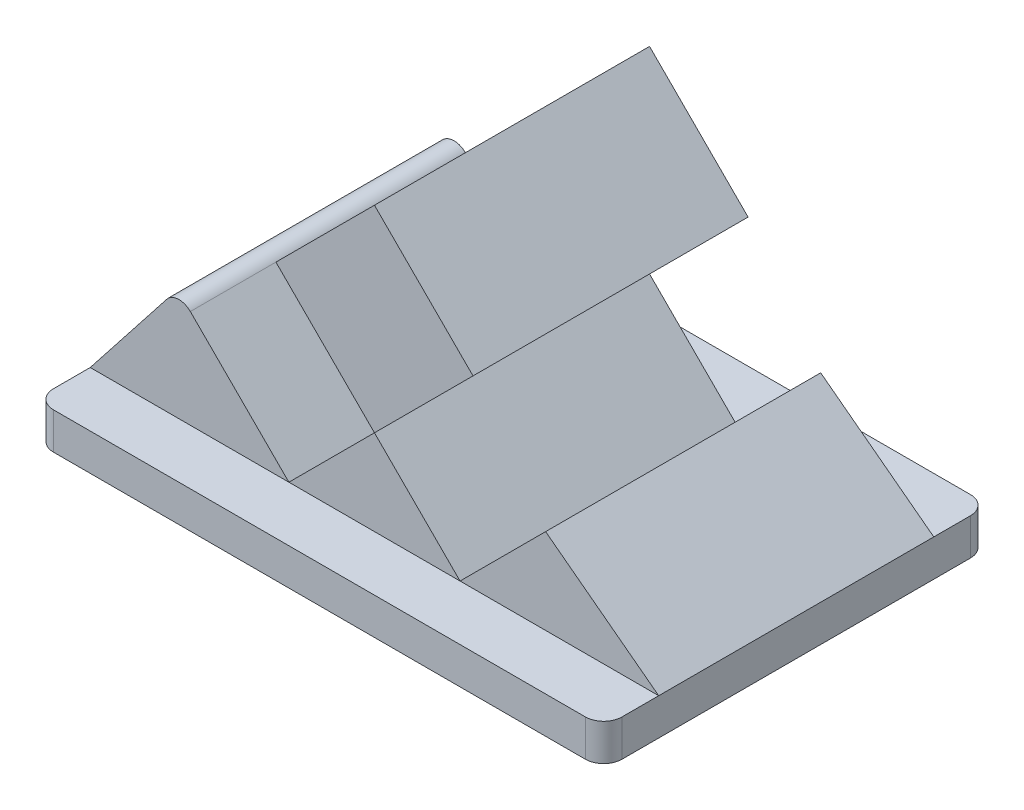
ISO-10303-21;
HEADER;
FILE_DESCRIPTION(('STEP AP214'),'2;1');
FILE_NAME('part.step','',(''),(''),'','','');
FILE_SCHEMA(('AUTOMOTIVE_DESIGN { 1 0 10303 214 1 1 1 1 }'));
ENDSEC;
DATA;
#1=APPLICATION_CONTEXT('core data for automotive mechanical design processes');
#2=APPLICATION_PROTOCOL_DEFINITION('international standard','automotive_design',2000,#1);
#3=PRODUCT_CONTEXT('',#1,'mechanical');
#4=PRODUCT('Part','Part','',(#3));
#5=PRODUCT_RELATED_PRODUCT_CATEGORY('part','',(#4));
#6=PRODUCT_DEFINITION_FORMATION('','',#4);
#7=PRODUCT_DEFINITION_CONTEXT('part definition',#1,'design');
#8=PRODUCT_DEFINITION('design','',#6,#7);
#9=PRODUCT_DEFINITION_SHAPE('','',#8);
#10=(LENGTH_UNIT() NAMED_UNIT(*) SI_UNIT(.MILLI.,.METRE.));
#11=(NAMED_UNIT(*) PLANE_ANGLE_UNIT() SI_UNIT($,.RADIAN.));
#12=(NAMED_UNIT(*) SI_UNIT($,.STERADIAN.) SOLID_ANGLE_UNIT());
#13=UNCERTAINTY_MEASURE_WITH_UNIT(LENGTH_MEASURE(1.E-05),#10,'distance_accuracy_value','');
#14=(GEOMETRIC_REPRESENTATION_CONTEXT(3) GLOBAL_UNCERTAINTY_ASSIGNED_CONTEXT((#13)) GLOBAL_UNIT_ASSIGNED_CONTEXT((#10,
#11,#12)) REPRESENTATION_CONTEXT('',''));
#15=CARTESIAN_POINT('',(0.,0.,0.));
#16=DIRECTION('',(0.,0.,1.));
#17=DIRECTION('',(1.,0.,0.));
#18=AXIS2_PLACEMENT_3D('',#15,#16,#17);
#19=CARTESIAN_POINT('',(87.0746391493337,87.0746391493336,75.));
#20=DIRECTION('',(0.707106781186548,0.707106781186547,0.));
#21=DIRECTION('',(-0.707106781186547,0.707106781186548,0.));
#22=AXIS2_PLACEMENT_3D('',#19,#20,#21);
#23=PLANE('',#22);
#24=DIRECTION('',(0.707106781186547,-0.707106781186548,0.));
#25=VECTOR('',#24,1.);
#26=CARTESIAN_POINT('',(87.0746391493337,87.0746391493336,-75.));
#27=LINE('',#26,#25);
#28=CARTESIAN_POINT('',(0.,174.149278298667,-75.));
#29=VERTEX_POINT('',#28);
#30=CARTESIAN_POINT('',(53.7401153701776,120.40916292849,-75.));
#31=VERTEX_POINT('',#30);
#32=EDGE_CURVE('E13',#29,#31,#27,.T.);
#33=ORIENTED_EDGE('',*,*,#32,.F.);
#34=DIRECTION('',(0.,0.,-1.));
#35=VECTOR('',#34,1.);
#36=CARTESIAN_POINT('',(0.,174.149278298667,75.));
#37=LINE('',#36,#35);
#38=CARTESIAN_POINT('',(0.,174.149278298667,75.));
#39=VERTEX_POINT('',#38);
#40=EDGE_CURVE('E128',#39,#29,#37,.T.);
#41=ORIENTED_EDGE('',*,*,#40,.F.);
#42=DIRECTION('',(0.707106781186547,-0.707106781186548,0.));
#43=VECTOR('',#42,1.);
#44=CARTESIAN_POINT('',(87.0746391493337,87.0746391493336,75.));
#45=LINE('',#44,#43);
#46=CARTESIAN_POINT('',(53.7401153701776,120.40916292849,75.));
#47=VERTEX_POINT('',#46);
#48=EDGE_CURVE('E173',#39,#47,#45,.T.);
#49=ORIENTED_EDGE('',*,*,#48,.T.);
#50=DIRECTION('',(0.,0.,-1.));
#51=VECTOR('',#50,1.);
#52=CARTESIAN_POINT('',(53.7401153701776,120.40916292849,75.));
#53=LINE('',#52,#51);
#54=EDGE_CURVE('E166',#47,#31,#53,.T.);
#55=ORIENTED_EDGE('',*,*,#54,.T.);
#56=EDGE_LOOP('',(#33,#41,#49,#55));
#57=FACE_BOUND('',#56,.T.);
#58=ADVANCED_FACE('F109',(#57),#23,.T.);
#59=CARTESIAN_POINT('',(-87.0746391493337,87.0746391493336,75.));
#60=DIRECTION('',(-0.707106781186548,0.707106781186547,0.));
#61=DIRECTION('',(-0.707106781186547,-0.707106781186548,0.));
#62=AXIS2_PLACEMENT_3D('',#59,#60,#61);
#63=PLANE('',#62);
#64=DIRECTION('',(0.707106781186547,0.707106781186548,0.));
#65=VECTOR('',#64,1.);
#66=CARTESIAN_POINT('',(-87.0746391493337,87.0746391493336,-75.));
#67=LINE('',#66,#65);
#68=CARTESIAN_POINT('',(-53.7401153701776,120.40916292849,-75.));
#69=VERTEX_POINT('',#68);
#70=EDGE_CURVE('E119',#69,#29,#67,.T.);
#71=ORIENTED_EDGE('',*,*,#70,.F.);
#72=DIRECTION('',(0.,0.,-1.));
#73=VECTOR('',#72,1.);
#74=CARTESIAN_POINT('',(-53.7401153701776,120.40916292849,75.));
#75=LINE('',#74,#73);
#76=CARTESIAN_POINT('',(-53.7401153701776,120.40916292849,75.));
#77=VERTEX_POINT('',#76);
#78=EDGE_CURVE('E169',#77,#69,#75,.T.);
#79=ORIENTED_EDGE('',*,*,#78,.F.);
#80=DIRECTION('',(0.707106781186547,0.707106781186548,0.));
#81=VECTOR('',#80,1.);
#82=CARTESIAN_POINT('',(-87.0746391493337,87.0746391493336,75.));
#83=LINE('',#82,#81);
#84=EDGE_CURVE('E162',#77,#39,#83,.T.);
#85=ORIENTED_EDGE('',*,*,#84,.T.);
#86=ORIENTED_EDGE('',*,*,#40,.T.);
#87=EDGE_LOOP('',(#71,#79,#85,#86));
#88=FACE_BOUND('',#87,.T.);
#89=ADVANCED_FACE('F182',(#88),#63,.T.);
#90=CARTESIAN_POINT('',(33.3345237791561,33.3345237791561,75.));
#91=DIRECTION('',(-0.707106781186548,-0.707106781186548,0.));
#92=DIRECTION('',(0.707106781186548,-0.707106781186548,0.));
#93=AXIS2_PLACEMENT_3D('',#90,#91,#92);
#94=PLANE('',#93);
#95=DIRECTION('',(-0.707106781186548,0.707106781186548,0.));
#96=VECTOR('',#95,1.);
#97=CARTESIAN_POINT('',(33.3345237791561,33.3345237791561,-75.));
#98=LINE('',#97,#96);
#99=CARTESIAN_POINT('',(0.,66.6690475583121,-75.));
#100=VERTEX_POINT('',#99);
#101=EDGE_CURVE('E155',#100,#69,#98,.T.);
#102=ORIENTED_EDGE('',*,*,#101,.F.);
#103=DIRECTION('',(0.,0.,-1.));
#104=VECTOR('',#103,1.);
#105=CARTESIAN_POINT('',(0.,66.6690475583121,75.));
#106=LINE('',#105,#104);
#107=CARTESIAN_POINT('',(0.,66.6690475583121,75.));
#108=VERTEX_POINT('',#107);
#109=EDGE_CURVE('E113',#108,#100,#106,.T.);
#110=ORIENTED_EDGE('',*,*,#109,.F.);
#111=DIRECTION('',(-0.707106781186548,0.707106781186548,0.));
#112=VECTOR('',#111,1.);
#113=CARTESIAN_POINT('',(33.3345237791561,33.3345237791561,75.));
#114=LINE('',#113,#112);
#115=EDGE_CURVE('E153',#108,#77,#114,.T.);
#116=ORIENTED_EDGE('',*,*,#115,.T.);
#117=ORIENTED_EDGE('',*,*,#78,.T.);
#118=EDGE_LOOP('',(#102,#110,#116,#117));
#119=FACE_BOUND('',#118,.T.);
#120=ADVANCED_FACE('F152',(#119),#94,.T.);
#121=CARTESIAN_POINT('',(-33.3345237791561,33.3345237791561,75.));
#122=DIRECTION('',(-0.707106781186547,0.707106781186548,0.));
#123=DIRECTION('',(-0.707106781186548,-0.707106781186547,0.));
#124=AXIS2_PLACEMENT_3D('',#121,#122,#123);
#125=PLANE('',#124);
#126=DIRECTION('',(0.707106781186548,0.707106781186547,0.));
#127=VECTOR('',#126,1.);
#128=CARTESIAN_POINT('',(-33.3345237791561,33.3345237791561,-75.));
#129=LINE('',#128,#127);
#130=EDGE_CURVE('E174',#100,#31,#129,.T.);
#131=ORIENTED_EDGE('',*,*,#130,.T.);
#132=ORIENTED_EDGE('',*,*,#54,.F.);
#133=DIRECTION('',(0.707106781186548,0.707106781186547,0.));
#134=VECTOR('',#133,1.);
#135=CARTESIAN_POINT('',(-33.3345237791561,33.3345237791561,75.));
#136=LINE('',#135,#134);
#137=EDGE_CURVE('E160',#108,#47,#136,.T.);
#138=ORIENTED_EDGE('',*,*,#137,.F.);
#139=ORIENTED_EDGE('',*,*,#109,.T.);
#140=EDGE_LOOP('',(#131,#132,#138,#139));
#141=FACE_BOUND('',#140,.T.);
#142=ADVANCED_FACE('F164',(#141),#125,.F.);
#143=CARTESIAN_POINT('',(0.,0.,75.));
#144=DIRECTION('',(0.,0.,1.));
#145=DIRECTION('',(1.,0.,0.));
#146=AXIS2_PLACEMENT_3D('',#143,#144,#145);
#147=PLANE('',#146);
#148=ORIENTED_EDGE('',*,*,#48,.F.);
#149=ORIENTED_EDGE('',*,*,#84,.F.);
#150=ORIENTED_EDGE('',*,*,#115,.F.);
#151=ORIENTED_EDGE('',*,*,#137,.T.);
#152=EDGE_LOOP('',(#148,#149,#150,#151));
#153=FACE_BOUND('',#152,.T.);
#154=ADVANCED_FACE('F111',(#153),#147,.T.);
#155=CARTESIAN_POINT('',(0.,0.,-75.));
#156=DIRECTION('',(0.,0.,1.));
#157=DIRECTION('',(1.,0.,0.));
#158=AXIS2_PLACEMENT_3D('',#155,#156,#157);
#159=PLANE('',#158);
#160=ORIENTED_EDGE('',*,*,#32,.T.);
#161=ORIENTED_EDGE('',*,*,#130,.F.);
#162=ORIENTED_EDGE('',*,*,#101,.T.);
#163=ORIENTED_EDGE('',*,*,#70,.T.);
#164=EDGE_LOOP('',(#160,#161,#162,#163));
#165=FACE_BOUND('',#164,.T.);
#166=ADVANCED_FACE('F181',(#165),#159,.F.);
#167=CLOSED_SHELL('',(#58,#89,#120,#142,#154,#166));
#168=MANIFOLD_SOLID_BREP('B2',#167);
#169=CARTESIAN_POINT('',(-145.,20.,95.));
#170=DIRECTION('',(0.,1.,0.));
#171=DIRECTION('',(0.,0.,1.));
#172=AXIS2_PLACEMENT_3D('',#169,#170,#171);
#173=PLANE('',#172);
#174=DIRECTION('',(0.,0.,1.));
#175=VECTOR('',#174,1.);
#176=CARTESIAN_POINT('',(-155.,20.,-95.));
#177=LINE('',#176,#175);
#178=CARTESIAN_POINT('',(-155.,20.,-95.));
#179=VERTEX_POINT('',#178);
#180=CARTESIAN_POINT('',(-155.,20.,-75.));
#181=VERTEX_POINT('',#180);
#182=EDGE_CURVE('E373',#179,#181,#177,.T.);
#183=ORIENTED_EDGE('',*,*,#182,.T.);
#184=DIRECTION('',(1.,0.,0.));
#185=VECTOR('',#184,1.);
#186=CARTESIAN_POINT('',(0.,20.,-75.));
#187=LINE('',#186,#185);
#188=CARTESIAN_POINT('',(-46.6690475583122,20.,-75.));
#189=VERTEX_POINT('',#188);
#190=EDGE_CURVE('E371',#181,#189,#187,.T.);
#191=ORIENTED_EDGE('',*,*,#190,.T.);
#192=DIRECTION('',(1.,0.,0.));
#193=VECTOR('',#192,1.);
#194=CARTESIAN_POINT('',(0.,20.,-75.));
#195=LINE('',#194,#193);
#196=CARTESIAN_POINT('',(46.6690475583122,20.,-75.));
#197=VERTEX_POINT('',#196);
#198=EDGE_CURVE('E348',#189,#197,#195,.T.);
#199=ORIENTED_EDGE('',*,*,#198,.T.);
#200=DIRECTION('',(1.,0.,0.));
#201=VECTOR('',#200,1.);
#202=CARTESIAN_POINT('',(0.,20.,-75.));
#203=LINE('',#202,#201);
#204=CARTESIAN_POINT('',(155.,20.,-75.));
#205=VERTEX_POINT('',#204);
#206=EDGE_CURVE('E416',#197,#205,#203,.T.);
#207=ORIENTED_EDGE('',*,*,#206,.T.);
#208=DIRECTION('',(0.,0.,-1.));
#209=VECTOR('',#208,1.);
#210=CARTESIAN_POINT('',(155.,20.,-95.));
#211=LINE('',#210,#209);
#212=CARTESIAN_POINT('',(155.,20.,-95.));
#213=VERTEX_POINT('',#212);
#214=EDGE_CURVE('E430',#205,#213,#211,.T.);
#215=ORIENTED_EDGE('',*,*,#214,.T.);
#216=CARTESIAN_POINT('',(145.,20.,-95.));
#217=DIRECTION('',(0.,1.,0.));
#218=DIRECTION('',(0.,0.,-1.));
#219=AXIS2_PLACEMENT_3D('',#216,#217,#218);
#220=CIRCLE('',#219,10.);
#221=CARTESIAN_POINT('',(145.,20.,-105.));
#222=VERTEX_POINT('',#221);
#223=EDGE_CURVE('E434',#213,#222,#220,.T.);
#224=ORIENTED_EDGE('',*,*,#223,.T.);
#225=DIRECTION('',(-1.,0.,0.));
#226=VECTOR('',#225,1.);
#227=CARTESIAN_POINT('',(-145.,20.,-105.));
#228=LINE('',#227,#226);
#229=CARTESIAN_POINT('',(-145.,20.,-105.));
#230=VERTEX_POINT('',#229);
#231=EDGE_CURVE('E436',#222,#230,#228,.T.);
#232=ORIENTED_EDGE('',*,*,#231,.T.);
#233=CARTESIAN_POINT('',(-145.,20.,-95.));
#234=DIRECTION('',(0.,1.,0.));
#235=DIRECTION('',(0.,0.,1.));
#236=AXIS2_PLACEMENT_3D('',#233,#234,#235);
#237=CIRCLE('',#236,10.);
#238=EDGE_CURVE('E438',#230,#179,#237,.T.);
#239=ORIENTED_EDGE('',*,*,#238,.T.);
#240=EDGE_LOOP('',(#183,#191,#199,#207,#215,#224,#232,#239));
#241=FACE_BOUND('',#240,.T.);
#242=ADVANCED_FACE('F233',(#241),#173,.T.);
#243=DIRECTION('',(1.,0.,0.));
#244=VECTOR('',#243,1.);
#245=CARTESIAN_POINT('',(0.,20.,75.));
#246=LINE('',#245,#244);
#247=CARTESIAN_POINT('',(-155.,20.,75.));
#248=VERTEX_POINT('',#247);
#249=CARTESIAN_POINT('',(-46.6690475583122,20.,75.));
#250=VERTEX_POINT('',#249);
#251=EDGE_CURVE('E248',#248,#250,#246,.T.);
#252=ORIENTED_EDGE('',*,*,#251,.F.);
#253=CARTESIAN_POINT('',(-155.,20.,95.));
#254=VERTEX_POINT('',#253);
#255=EDGE_CURVE('E440',#248,#254,#177,.T.);
#256=ORIENTED_EDGE('',*,*,#255,.T.);
#257=CARTESIAN_POINT('',(-145.,20.,95.));
#258=DIRECTION('',(0.,1.,0.));
#259=DIRECTION('',(0.,0.,1.));
#260=AXIS2_PLACEMENT_3D('',#257,#258,#259);
#261=CIRCLE('',#260,10.);
#262=CARTESIAN_POINT('',(-145.,20.,105.));
#263=VERTEX_POINT('',#262);
#264=EDGE_CURVE('E422',#254,#263,#261,.T.);
#265=ORIENTED_EDGE('',*,*,#264,.T.);
#266=DIRECTION('',(1.,0.,0.));
#267=VECTOR('',#266,1.);
#268=CARTESIAN_POINT('',(-145.,20.,105.));
#269=LINE('',#268,#267);
#270=CARTESIAN_POINT('',(145.,20.,105.));
#271=VERTEX_POINT('',#270);
#272=EDGE_CURVE('E425',#263,#271,#269,.T.);
#273=ORIENTED_EDGE('',*,*,#272,.T.);
#274=CARTESIAN_POINT('',(145.,20.,95.));
#275=DIRECTION('',(0.,1.,0.));
#276=DIRECTION('',(0.,0.,1.));
#277=AXIS2_PLACEMENT_3D('',#274,#275,#276);
#278=CIRCLE('',#277,10.);
#279=CARTESIAN_POINT('',(155.,20.,95.));
#280=VERTEX_POINT('',#279);
#281=EDGE_CURVE('E428',#271,#280,#278,.T.);
#282=ORIENTED_EDGE('',*,*,#281,.T.);
#283=CARTESIAN_POINT('',(155.,20.,75.));
#284=VERTEX_POINT('',#283);
#285=EDGE_CURVE('E431',#280,#284,#211,.T.);
#286=ORIENTED_EDGE('',*,*,#285,.T.);
#287=DIRECTION('',(1.,0.,0.));
#288=VECTOR('',#287,1.);
#289=CARTESIAN_POINT('',(0.,20.,75.));
#290=LINE('',#289,#288);
#291=CARTESIAN_POINT('',(46.6690475583122,20.,75.));
#292=VERTEX_POINT('',#291);
#293=EDGE_CURVE('E408',#292,#284,#290,.T.);
#294=ORIENTED_EDGE('',*,*,#293,.F.);
#295=DIRECTION('',(1.,0.,0.));
#296=VECTOR('',#295,1.);
#297=CARTESIAN_POINT('',(0.,20.,75.));
#298=LINE('',#297,#296);
#299=EDGE_CURVE('E394',#250,#292,#298,.T.);
#300=ORIENTED_EDGE('',*,*,#299,.F.);
#301=EDGE_LOOP('',(#252,#256,#265,#273,#282,#286,#294,#300));
#302=FACE_BOUND('',#301,.T.);
#303=ADVANCED_FACE('F505',(#302),#173,.T.);
#304=CARTESIAN_POINT('',(-145.,20.,95.));
#305=DIRECTION('',(0.,-1.,0.));
#306=DIRECTION('',(0.,0.,-1.));
#307=AXIS2_PLACEMENT_3D('',#304,#305,#306);
#308=CYLINDRICAL_SURFACE('',#307,10.);
#309=CARTESIAN_POINT('',(-145.,0.,95.));
#310=DIRECTION('',(0.,1.,0.));
#311=DIRECTION('',(0.,0.,1.));
#312=AXIS2_PLACEMENT_3D('',#309,#310,#311);
#313=CIRCLE('',#312,10.);
#314=CARTESIAN_POINT('',(-155.,0.,95.));
#315=VERTEX_POINT('',#314);
#316=CARTESIAN_POINT('',(-145.,0.,105.));
#317=VERTEX_POINT('',#316);
#318=EDGE_CURVE('E403',#315,#317,#313,.T.);
#319=ORIENTED_EDGE('',*,*,#318,.T.);
#320=DIRECTION('',(0.,-1.,0.));
#321=VECTOR('',#320,1.);
#322=CARTESIAN_POINT('',(-145.,20.,105.));
#323=LINE('',#322,#321);
#324=EDGE_CURVE('E107',#263,#317,#323,.T.);
#325=ORIENTED_EDGE('',*,*,#324,.F.);
#326=ORIENTED_EDGE('',*,*,#264,.F.);
#327=DIRECTION('',(0.,-1.,0.));
#328=VECTOR('',#327,1.);
#329=CARTESIAN_POINT('',(-155.,20.,95.));
#330=LINE('',#329,#328);
#331=EDGE_CURVE('E442',#254,#315,#330,.T.);
#332=ORIENTED_EDGE('',*,*,#331,.T.);
#333=EDGE_LOOP('',(#319,#325,#326,#332));
#334=FACE_BOUND('',#333,.T.);
#335=ADVANCED_FACE('F235',(#334),#308,.T.);
#336=CARTESIAN_POINT('',(-145.,20.,105.));
#337=DIRECTION('',(0.,0.,-1.));
#338=DIRECTION('',(-1.,0.,0.));
#339=AXIS2_PLACEMENT_3D('',#336,#337,#338);
#340=PLANE('',#339);
#341=DIRECTION('',(1.,0.,0.));
#342=VECTOR('',#341,1.);
#343=CARTESIAN_POINT('',(-145.,0.,105.));
#344=LINE('',#343,#342);
#345=CARTESIAN_POINT('',(145.,0.,105.));
#346=VERTEX_POINT('',#345);
#347=EDGE_CURVE('E445',#317,#346,#344,.T.);
#348=ORIENTED_EDGE('',*,*,#347,.T.);
#349=DIRECTION('',(0.,-1.,0.));
#350=VECTOR('',#349,1.);
#351=CARTESIAN_POINT('',(145.,20.,105.));
#352=LINE('',#351,#350);
#353=EDGE_CURVE('E241',#271,#346,#352,.T.);
#354=ORIENTED_EDGE('',*,*,#353,.F.);
#355=ORIENTED_EDGE('',*,*,#272,.F.);
#356=ORIENTED_EDGE('',*,*,#324,.T.);
#357=EDGE_LOOP('',(#348,#354,#355,#356));
#358=FACE_BOUND('',#357,.T.);
#359=ADVANCED_FACE('F508',(#358),#340,.F.);
#360=CARTESIAN_POINT('',(145.,20.,95.));
#361=DIRECTION('',(0.,-1.,0.));
#362=DIRECTION('',(0.,0.,-1.));
#363=AXIS2_PLACEMENT_3D('',#360,#361,#362);
#364=CYLINDRICAL_SURFACE('',#363,10.);
#365=CARTESIAN_POINT('',(145.,0.,95.));
#366=DIRECTION('',(0.,1.,0.));
#367=DIRECTION('',(0.,0.,1.));
#368=AXIS2_PLACEMENT_3D('',#365,#366,#367);
#369=CIRCLE('',#368,10.);
#370=CARTESIAN_POINT('',(155.,0.,95.));
#371=VERTEX_POINT('',#370);
#372=EDGE_CURVE('E447',#346,#371,#369,.T.);
#373=ORIENTED_EDGE('',*,*,#372,.T.);
#374=DIRECTION('',(0.,-1.,0.));
#375=VECTOR('',#374,1.);
#376=CARTESIAN_POINT('',(155.,20.,95.));
#377=LINE('',#376,#375);
#378=EDGE_CURVE('E472',#280,#371,#377,.T.);
#379=ORIENTED_EDGE('',*,*,#378,.F.);
#380=ORIENTED_EDGE('',*,*,#281,.F.);
#381=ORIENTED_EDGE('',*,*,#353,.T.);
#382=EDGE_LOOP('',(#373,#379,#380,#381));
#383=FACE_BOUND('',#382,.T.);
#384=ADVANCED_FACE('F479',(#383),#364,.T.);
#385=CARTESIAN_POINT('',(155.,20.,-95.));
#386=DIRECTION('',(-1.,0.,0.));
#387=DIRECTION('',(0.,0.,1.));
#388=AXIS2_PLACEMENT_3D('',#385,#386,#387);
#389=PLANE('',#388);
#390=DIRECTION('',(0.,0.,-1.));
#391=VECTOR('',#390,1.);
#392=CARTESIAN_POINT('',(155.,0.,-95.));
#393=LINE('',#392,#391);
#394=CARTESIAN_POINT('',(155.,0.,-95.));
#395=VERTEX_POINT('',#394);
#396=EDGE_CURVE('E449',#371,#395,#393,.T.);
#397=ORIENTED_EDGE('',*,*,#396,.T.);
#398=DIRECTION('',(0.,-1.,0.));
#399=VECTOR('',#398,1.);
#400=CARTESIAN_POINT('',(155.,20.,-95.));
#401=LINE('',#400,#399);
#402=EDGE_CURVE('E469',#213,#395,#401,.T.);
#403=ORIENTED_EDGE('',*,*,#402,.F.);
#404=ORIENTED_EDGE('',*,*,#214,.F.);
#405=DIRECTION('',(0.,0.,-1.));
#406=VECTOR('',#405,1.);
#407=CARTESIAN_POINT('',(155.,20.,75.));
#408=LINE('',#407,#406);
#409=EDGE_CURVE('E404',#284,#205,#408,.T.);
#410=ORIENTED_EDGE('',*,*,#409,.F.);
#411=ORIENTED_EDGE('',*,*,#285,.F.);
#412=ORIENTED_EDGE('',*,*,#378,.T.);
#413=EDGE_LOOP('',(#397,#403,#404,#410,#411,#412));
#414=FACE_BOUND('',#413,.T.);
#415=ADVANCED_FACE('F490',(#414),#389,.F.);
#416=CARTESIAN_POINT('',(145.,20.,-95.));
#417=DIRECTION('',(0.,-1.,0.));
#418=DIRECTION('',(0.,0.,-1.));
#419=AXIS2_PLACEMENT_3D('',#416,#417,#418);
#420=CYLINDRICAL_SURFACE('',#419,10.);
#421=CARTESIAN_POINT('',(145.,0.,-95.));
#422=DIRECTION('',(0.,1.,0.));
#423=DIRECTION('',(0.,0.,-1.));
#424=AXIS2_PLACEMENT_3D('',#421,#422,#423);
#425=CIRCLE('',#424,10.);
#426=CARTESIAN_POINT('',(145.,0.,-105.));
#427=VERTEX_POINT('',#426);
#428=EDGE_CURVE('E451',#395,#427,#425,.T.);
#429=ORIENTED_EDGE('',*,*,#428,.T.);
#430=DIRECTION('',(0.,-1.,0.));
#431=VECTOR('',#430,1.);
#432=CARTESIAN_POINT('',(145.,20.,-105.));
#433=LINE('',#432,#431);
#434=EDGE_CURVE('E466',#222,#427,#433,.T.);
#435=ORIENTED_EDGE('',*,*,#434,.F.);
#436=ORIENTED_EDGE('',*,*,#223,.F.);
#437=ORIENTED_EDGE('',*,*,#402,.T.);
#438=EDGE_LOOP('',(#429,#435,#436,#437));
#439=FACE_BOUND('',#438,.T.);
#440=ADVANCED_FACE('F495',(#439),#420,.T.);
#441=CARTESIAN_POINT('',(-145.,20.,-105.));
#442=DIRECTION('',(0.,0.,1.));
#443=DIRECTION('',(1.,0.,0.));
#444=AXIS2_PLACEMENT_3D('',#441,#442,#443);
#445=PLANE('',#444);
#446=DIRECTION('',(-1.,0.,0.));
#447=VECTOR('',#446,1.);
#448=CARTESIAN_POINT('',(-145.,0.,-105.));
#449=LINE('',#448,#447);
#450=CARTESIAN_POINT('',(-145.,0.,-105.));
#451=VERTEX_POINT('',#450);
#452=EDGE_CURVE('E453',#427,#451,#449,.T.);
#453=ORIENTED_EDGE('',*,*,#452,.T.);
#454=DIRECTION('',(0.,-1.,0.));
#455=VECTOR('',#454,1.);
#456=CARTESIAN_POINT('',(-145.,20.,-105.));
#457=LINE('',#456,#455);
#458=EDGE_CURVE('E463',#230,#451,#457,.T.);
#459=ORIENTED_EDGE('',*,*,#458,.F.);
#460=ORIENTED_EDGE('',*,*,#231,.F.);
#461=ORIENTED_EDGE('',*,*,#434,.T.);
#462=EDGE_LOOP('',(#453,#459,#460,#461));
#463=FACE_BOUND('',#462,.T.);
#464=ADVANCED_FACE('F519',(#463),#445,.F.);
#465=CARTESIAN_POINT('',(-145.,20.,-95.));
#466=DIRECTION('',(0.,-1.,0.));
#467=DIRECTION('',(0.,0.,-1.));
#468=AXIS2_PLACEMENT_3D('',#465,#466,#467);
#469=CYLINDRICAL_SURFACE('',#468,10.);
#470=CARTESIAN_POINT('',(-145.,0.,-95.));
#471=DIRECTION('',(0.,1.,0.));
#472=DIRECTION('',(0.,0.,1.));
#473=AXIS2_PLACEMENT_3D('',#470,#471,#472);
#474=CIRCLE('',#473,10.);
#475=CARTESIAN_POINT('',(-155.,0.,-95.));
#476=VERTEX_POINT('',#475);
#477=EDGE_CURVE('E455',#451,#476,#474,.T.);
#478=ORIENTED_EDGE('',*,*,#477,.T.);
#479=DIRECTION('',(0.,-1.,0.));
#480=VECTOR('',#479,1.);
#481=CARTESIAN_POINT('',(-155.,20.,-95.));
#482=LINE('',#481,#480);
#483=EDGE_CURVE('E460',#179,#476,#482,.T.);
#484=ORIENTED_EDGE('',*,*,#483,.F.);
#485=ORIENTED_EDGE('',*,*,#238,.F.);
#486=ORIENTED_EDGE('',*,*,#458,.T.);
#487=EDGE_LOOP('',(#478,#484,#485,#486));
#488=FACE_BOUND('',#487,.T.);
#489=ADVANCED_FACE('F517',(#488),#469,.T.);
#490=CARTESIAN_POINT('',(-155.,20.,-95.));
#491=DIRECTION('',(1.,0.,0.));
#492=DIRECTION('',(0.,0.,-1.));
#493=AXIS2_PLACEMENT_3D('',#490,#491,#492);
#494=PLANE('',#493);
#495=DIRECTION('',(0.,0.,1.));
#496=VECTOR('',#495,1.);
#497=CARTESIAN_POINT('',(-155.,0.,-95.));
#498=LINE('',#497,#496);
#499=EDGE_CURVE('E426',#476,#315,#498,.T.);
#500=ORIENTED_EDGE('',*,*,#499,.T.);
#501=ORIENTED_EDGE('',*,*,#331,.F.);
#502=ORIENTED_EDGE('',*,*,#255,.F.);
#503=DIRECTION('',(0.,0.,-1.));
#504=VECTOR('',#503,1.);
#505=CARTESIAN_POINT('',(-155.,20.,75.));
#506=LINE('',#505,#504);
#507=EDGE_CURVE('E255',#248,#181,#506,.T.);
#508=ORIENTED_EDGE('',*,*,#507,.T.);
#509=ORIENTED_EDGE('',*,*,#182,.F.);
#510=ORIENTED_EDGE('',*,*,#483,.T.);
#511=EDGE_LOOP('',(#500,#501,#502,#508,#509,#510));
#512=FACE_BOUND('',#511,.T.);
#513=ADVANCED_FACE('F513',(#512),#494,.F.);
#514=CARTESIAN_POINT('',(-145.,0.,95.));
#515=DIRECTION('',(0.,1.,0.));
#516=DIRECTION('',(0.,0.,1.));
#517=AXIS2_PLACEMENT_3D('',#514,#515,#516);
#518=PLANE('',#517);
#519=ORIENTED_EDGE('',*,*,#318,.F.);
#520=ORIENTED_EDGE('',*,*,#499,.F.);
#521=ORIENTED_EDGE('',*,*,#477,.F.);
#522=ORIENTED_EDGE('',*,*,#452,.F.);
#523=ORIENTED_EDGE('',*,*,#428,.F.);
#524=ORIENTED_EDGE('',*,*,#396,.F.);
#525=ORIENTED_EDGE('',*,*,#372,.F.);
#526=ORIENTED_EDGE('',*,*,#347,.F.);
#527=EDGE_LOOP('',(#519,#520,#521,#522,#523,#524,#525,#526));
#528=FACE_BOUND('',#527,.T.);
#529=ADVANCED_FACE('F485',(#528),#518,.F.);
#530=CARTESIAN_POINT('',(13.3345237791563,-13.3345237791562,75.));
#531=DIRECTION('',(-0.70710678118655,0.707106781186545,0.));
#532=DIRECTION('',(-0.707106781186545,-0.70710678118655,0.));
#533=AXIS2_PLACEMENT_3D('',#530,#531,#532);
#534=PLANE('',#533);
#535=DIRECTION('',(0.707106781186545,0.70710678118655,0.));
#536=VECTOR('',#535,1.);
#537=CARTESIAN_POINT('',(13.3345237791563,-13.3345237791562,-75.));
#538=LINE('',#537,#536);
#539=CARTESIAN_POINT('',(93.338095116624,66.6690475583121,-75.));
#540=VERTEX_POINT('',#539);
#541=EDGE_CURVE('E368',#197,#540,#538,.T.);
#542=ORIENTED_EDGE('',*,*,#541,.F.);
#543=DIRECTION('',(0.,0.,-1.));
#544=VECTOR('',#543,1.);
#545=CARTESIAN_POINT('',(46.6690475583122,20.,75.));
#546=LINE('',#545,#544);
#547=EDGE_CURVE('E401',#292,#197,#546,.T.);
#548=ORIENTED_EDGE('',*,*,#547,.F.);
#549=DIRECTION('',(0.707106781186545,0.70710678118655,0.));
#550=VECTOR('',#549,1.);
#551=CARTESIAN_POINT('',(13.3345237791563,-13.3345237791562,75.));
#552=LINE('',#551,#550);
#553=CARTESIAN_POINT('',(93.338095116624,66.6690475583121,75.));
#554=VERTEX_POINT('',#553);
#555=EDGE_CURVE('E405',#292,#554,#552,.T.);
#556=ORIENTED_EDGE('',*,*,#555,.T.);
#557=DIRECTION('',(0.,0.,-1.));
#558=VECTOR('',#557,1.);
#559=CARTESIAN_POINT('',(93.338095116624,66.6690475583121,75.));
#560=LINE('',#559,#558);
#561=EDGE_CURVE('E413',#554,#540,#560,.T.);
#562=ORIENTED_EDGE('',*,*,#561,.T.);
#563=EDGE_LOOP('',(#542,#548,#556,#562));
#564=FACE_BOUND('',#563,.T.);
#565=ADVANCED_FACE('F536',(#564),#534,.T.);
#566=CARTESIAN_POINT('',(66.0754948384759,87.3028504119629,75.));
#567=DIRECTION('',(-0.603491875569323,-0.797369146707986,0.));
#568=DIRECTION('',(0.797369146707986,-0.603491875569323,0.));
#569=AXIS2_PLACEMENT_3D('',#566,#567,#568);
#570=PLANE('',#569);
#571=DIRECTION('',(-0.797369146707986,0.603491875569323,0.));
#572=VECTOR('',#571,1.);
#573=CARTESIAN_POINT('',(66.0754948384759,87.3028504119629,-75.));
#574=LINE('',#573,#572);
#575=EDGE_CURVE('E409',#205,#540,#574,.T.);
#576=ORIENTED_EDGE('',*,*,#575,.T.);
#577=ORIENTED_EDGE('',*,*,#561,.F.);
#578=DIRECTION('',(-0.797369146707986,0.603491875569323,0.));
#579=VECTOR('',#578,1.);
#580=CARTESIAN_POINT('',(66.0754948384759,87.3028504119629,75.));
#581=LINE('',#580,#579);
#582=EDGE_CURVE('E411',#284,#554,#581,.T.);
#583=ORIENTED_EDGE('',*,*,#582,.F.);
#584=ORIENTED_EDGE('',*,*,#409,.T.);
#585=EDGE_LOOP('',(#576,#577,#583,#584));
#586=FACE_BOUND('',#585,.T.);
#587=ADVANCED_FACE('F554',(#586),#570,.F.);
#588=CARTESIAN_POINT('',(0.,0.,75.));
#589=DIRECTION('',(0.,0.,1.));
#590=DIRECTION('',(1.,0.,0.));
#591=AXIS2_PLACEMENT_3D('',#588,#589,#590);
#592=PLANE('',#591);
#593=ORIENTED_EDGE('',*,*,#555,.F.);
#594=ORIENTED_EDGE('',*,*,#293,.T.);
#595=ORIENTED_EDGE('',*,*,#582,.T.);
#596=EDGE_LOOP('',(#593,#594,#595));
#597=FACE_BOUND('',#596,.T.);
#598=ADVANCED_FACE('F564',(#597),#592,.T.);
#599=CARTESIAN_POINT('',(0.,0.,-75.));
#600=DIRECTION('',(0.,0.,1.));
#601=DIRECTION('',(1.,0.,0.));
#602=AXIS2_PLACEMENT_3D('',#599,#600,#601);
#603=PLANE('',#602);
#604=ORIENTED_EDGE('',*,*,#541,.T.);
#605=ORIENTED_EDGE('',*,*,#575,.F.);
#606=ORIENTED_EDGE('',*,*,#206,.F.);
#607=EDGE_LOOP('',(#604,#605,#606));
#608=FACE_BOUND('',#607,.T.);
#609=ADVANCED_FACE('F540',(#608),#603,.F.);
#610=CARTESIAN_POINT('',(-33.3345237791561,33.3345237791561,75.));
#611=DIRECTION('',(0.707106781186547,-0.707106781186548,0.));
#612=DIRECTION('',(0.707106781186548,0.707106781186547,0.));
#613=AXIS2_PLACEMENT_3D('',#610,#611,#612);
#614=PLANE('',#613);
#615=DIRECTION('',(-0.707106781186548,-0.707106781186547,0.));
#616=VECTOR('',#615,1.);
#617=CARTESIAN_POINT('',(-33.3345237791561,33.3345237791561,-75.));
#618=LINE('',#617,#616);
#619=CARTESIAN_POINT('',(0.,66.6690475583121,-75.));
#620=VERTEX_POINT('',#619);
#621=EDGE_CURVE('E351',#620,#189,#618,.T.);
#622=ORIENTED_EDGE('',*,*,#621,.T.);
#623=DIRECTION('',(0.,0.,-1.));
#624=VECTOR('',#623,1.);
#625=CARTESIAN_POINT('',(-46.6690475583122,20.,75.));
#626=LINE('',#625,#624);
#627=EDGE_CURVE('E364',#250,#189,#626,.T.);
#628=ORIENTED_EDGE('',*,*,#627,.F.);
#629=DIRECTION('',(-0.707106781186548,-0.707106781186547,0.));
#630=VECTOR('',#629,1.);
#631=CARTESIAN_POINT('',(-33.3345237791561,33.3345237791561,75.));
#632=LINE('',#631,#630);
#633=CARTESIAN_POINT('',(0.,66.6690475583121,75.));
#634=VERTEX_POINT('',#633);
#635=EDGE_CURVE('E398',#634,#250,#632,.T.);
#636=ORIENTED_EDGE('',*,*,#635,.F.);
#637=DIRECTION('',(0.,0.,-1.));
#638=VECTOR('',#637,1.);
#639=CARTESIAN_POINT('',(0.,66.6690475583121,75.));
#640=LINE('',#639,#638);
#641=EDGE_CURVE('E367',#634,#620,#640,.T.);
#642=ORIENTED_EDGE('',*,*,#641,.T.);
#643=EDGE_LOOP('',(#622,#628,#636,#642));
#644=FACE_BOUND('',#643,.T.);
#645=ADVANCED_FACE('F361',(#644),#614,.F.);
#646=CARTESIAN_POINT('',(33.3345237791561,33.3345237791561,75.));
#647=DIRECTION('',(0.707106781186547,0.707106781186548,0.));
#648=DIRECTION('',(-0.707106781186548,0.707106781186547,0.));
#649=AXIS2_PLACEMENT_3D('',#646,#647,#648);
#650=PLANE('',#649);
#651=DIRECTION('',(0.707106781186548,-0.707106781186547,0.));
#652=VECTOR('',#651,1.);
#653=CARTESIAN_POINT('',(33.3345237791561,33.3345237791561,-75.));
#654=LINE('',#653,#652);
#655=EDGE_CURVE('E353',#620,#197,#654,.T.);
#656=ORIENTED_EDGE('',*,*,#655,.F.);
#657=ORIENTED_EDGE('',*,*,#641,.F.);
#658=DIRECTION('',(0.707106781186548,-0.707106781186547,0.));
#659=VECTOR('',#658,1.);
#660=CARTESIAN_POINT('',(33.3345237791561,33.3345237791561,75.));
#661=LINE('',#660,#659);
#662=EDGE_CURVE('E391',#634,#292,#661,.T.);
#663=ORIENTED_EDGE('',*,*,#662,.T.);
#664=ORIENTED_EDGE('',*,*,#547,.T.);
#665=EDGE_LOOP('',(#656,#657,#663,#664));
#666=FACE_BOUND('',#665,.T.);
#667=ADVANCED_FACE('F590',(#666),#650,.T.);
#668=CARTESIAN_POINT('',(0.,0.,75.));
#669=DIRECTION('',(0.,0.,1.));
#670=DIRECTION('',(1.,0.,0.));
#671=AXIS2_PLACEMENT_3D('',#668,#669,#670);
#672=PLANE('',#671);
#673=ORIENTED_EDGE('',*,*,#635,.T.);
#674=ORIENTED_EDGE('',*,*,#299,.T.);
#675=ORIENTED_EDGE('',*,*,#662,.F.);
#676=EDGE_LOOP('',(#673,#674,#675));
#677=FACE_BOUND('',#676,.T.);
#678=ADVANCED_FACE('F599',(#677),#672,.T.);
#679=CARTESIAN_POINT('',(0.,0.,-75.));
#680=DIRECTION('',(0.,0.,1.));
#681=DIRECTION('',(1.,0.,0.));
#682=AXIS2_PLACEMENT_3D('',#679,#680,#681);
#683=PLANE('',#682);
#684=ORIENTED_EDGE('',*,*,#621,.F.);
#685=ORIENTED_EDGE('',*,*,#655,.T.);
#686=ORIENTED_EDGE('',*,*,#198,.F.);
#687=EDGE_LOOP('',(#684,#685,#686));
#688=FACE_BOUND('',#687,.T.);
#689=ADVANCED_FACE('F350',(#688),#683,.F.);
#690=CARTESIAN_POINT('',(-13.3345237791562,-13.3345237791562,75.));
#691=DIRECTION('',(-0.70710678118655,-0.707106781186545,0.));
#692=DIRECTION('',(0.707106781186545,-0.70710678118655,0.));
#693=AXIS2_PLACEMENT_3D('',#690,#691,#692);
#694=PLANE('',#693);
#695=DIRECTION('',(-0.707106781186545,0.70710678118655,0.));
#696=VECTOR('',#695,1.);
#697=CARTESIAN_POINT('',(-13.3345237791562,-13.3345237791562,-75.));
#698=LINE('',#697,#696);
#699=CARTESIAN_POINT('',(-100.40916292849,73.7401153701778,-75.));
#700=VERTEX_POINT('',#699);
#701=EDGE_CURVE('E381',#189,#700,#698,.T.);
#702=ORIENTED_EDGE('',*,*,#701,.T.);
#703=DIRECTION('',(0.,0.,-1.));
#704=VECTOR('',#703,1.);
#705=CARTESIAN_POINT('',(-100.40916292849,73.7401153701778,75.));
#706=LINE('',#705,#704);
#707=CARTESIAN_POINT('',(-100.40916292849,73.7401153701778,75.));
#708=VERTEX_POINT('',#707);
#709=EDGE_CURVE('E671',#708,#700,#706,.T.);
#710=ORIENTED_EDGE('',*,*,#709,.F.);
#711=DIRECTION('',(-0.707106781186545,0.70710678118655,0.));
#712=VECTOR('',#711,1.);
#713=CARTESIAN_POINT('',(-13.3345237791562,-13.3345237791562,75.));
#714=LINE('',#713,#712);
#715=EDGE_CURVE('E378',#250,#708,#714,.T.);
#716=ORIENTED_EDGE('',*,*,#715,.F.);
#717=ORIENTED_EDGE('',*,*,#627,.T.);
#718=EDGE_LOOP('',(#702,#710,#716,#717));
#719=FACE_BOUND('',#718,.T.);
#720=ADVANCED_FACE('F389',(#719),#694,.F.);
#721=CARTESIAN_POINT('',(-106.583385640542,67.5658926581258,75.));
#722=DIRECTION('',(0.,0.,-1.));
#723=DIRECTION('',(-1.,0.,0.));
#724=AXIS2_PLACEMENT_3D('',#721,#722,#723);
#725=CYLINDRICAL_SURFACE('',#724,8.73166949649589);
#726=CARTESIAN_POINT('',(-106.583385640542,67.5658926581258,-75.));
#727=DIRECTION('',(0.,0.,1.));
#728=DIRECTION('',(1.,0.,0.));
#729=AXIS2_PLACEMENT_3D('',#726,#727,#728);
#730=CIRCLE('',#729,8.73166949649589);
#731=CARTESIAN_POINT('',(-112.757608352594,73.7401153701779,-75.));
#732=VERTEX_POINT('',#731);
#733=EDGE_CURVE('E383',#700,#732,#730,.T.);
#734=ORIENTED_EDGE('',*,*,#733,.T.);
#735=DIRECTION('',(0.,0.,-1.));
#736=VECTOR('',#735,1.);
#737=CARTESIAN_POINT('',(-112.757608352594,73.7401153701779,75.));
#738=LINE('',#737,#736);
#739=CARTESIAN_POINT('',(-112.757608352594,73.7401153701779,75.));
#740=VERTEX_POINT('',#739);
#741=EDGE_CURVE('E672',#740,#732,#738,.T.);
#742=ORIENTED_EDGE('',*,*,#741,.F.);
#743=CARTESIAN_POINT('',(-106.583385640542,67.5658926581258,75.));
#744=DIRECTION('',(0.,0.,1.));
#745=DIRECTION('',(1.,0.,0.));
#746=AXIS2_PLACEMENT_3D('',#743,#744,#745);
#747=CIRCLE('',#746,8.73166949649589);
#748=EDGE_CURVE('E668',#708,#740,#747,.T.);
#749=ORIENTED_EDGE('',*,*,#748,.F.);
#750=ORIENTED_EDGE('',*,*,#709,.T.);
#751=EDGE_LOOP('',(#734,#742,#749,#750));
#752=FACE_BOUND('',#751,.T.);
#753=ADVANCED_FACE('F626',(#752),#725,.T.);
#754=CARTESIAN_POINT('',(-105.521818827218,82.9453745594233,75.));
#755=DIRECTION('',(0.786190286061105,-0.617984493416427,0.));
#756=DIRECTION('',(0.617984493416427,0.786190286061105,0.));
#757=AXIS2_PLACEMENT_3D('',#754,#755,#756);
#758=PLANE('',#757);
#759=DIRECTION('',(-0.617984493416427,-0.786190286061105,0.));
#760=VECTOR('',#759,1.);
#761=CARTESIAN_POINT('',(-105.521818827218,82.9453745594233,-75.));
#762=LINE('',#761,#760);
#763=EDGE_CURVE('E377',#732,#181,#762,.T.);
#764=ORIENTED_EDGE('',*,*,#763,.T.);
#765=ORIENTED_EDGE('',*,*,#507,.F.);
#766=DIRECTION('',(-0.617984493416427,-0.786190286061105,0.));
#767=VECTOR('',#766,1.);
#768=CARTESIAN_POINT('',(-105.521818827218,82.9453745594233,75.));
#769=LINE('',#768,#767);
#770=EDGE_CURVE('E681',#740,#248,#769,.T.);
#771=ORIENTED_EDGE('',*,*,#770,.F.);
#772=ORIENTED_EDGE('',*,*,#741,.T.);
#773=EDGE_LOOP('',(#764,#765,#771,#772));
#774=FACE_BOUND('',#773,.T.);
#775=ADVANCED_FACE('F635',(#774),#758,.F.);
#776=CARTESIAN_POINT('',(0.,0.,75.));
#777=DIRECTION('',(0.,0.,1.));
#778=DIRECTION('',(1.,0.,0.));
#779=AXIS2_PLACEMENT_3D('',#776,#777,#778);
#780=PLANE('',#779);
#781=ORIENTED_EDGE('',*,*,#715,.T.);
#782=ORIENTED_EDGE('',*,*,#748,.T.);
#783=ORIENTED_EDGE('',*,*,#770,.T.);
#784=ORIENTED_EDGE('',*,*,#251,.T.);
#785=EDGE_LOOP('',(#781,#782,#783,#784));
#786=FACE_BOUND('',#785,.T.);
#787=ADVANCED_FACE('F645',(#786),#780,.T.);
#788=CARTESIAN_POINT('',(0.,0.,-75.));
#789=DIRECTION('',(0.,0.,1.));
#790=DIRECTION('',(1.,0.,0.));
#791=AXIS2_PLACEMENT_3D('',#788,#789,#790);
#792=PLANE('',#791);
#793=ORIENTED_EDGE('',*,*,#701,.F.);
#794=ORIENTED_EDGE('',*,*,#190,.F.);
#795=ORIENTED_EDGE('',*,*,#763,.F.);
#796=ORIENTED_EDGE('',*,*,#733,.F.);
#797=EDGE_LOOP('',(#793,#794,#795,#796));
#798=FACE_BOUND('',#797,.T.);
#799=ADVANCED_FACE('F382',(#798),#792,.F.);
#800=CLOSED_SHELL('',(#242,#303,#335,#359,#384,#415,#440,#464,#489,#513,#529,#565,#587,#598,
#609,#645,#667,#678,#689,#720,#753,#775,#787,#799));
#801=MANIFOLD_SOLID_BREP('B7',#800);
#802=ADVANCED_BREP_SHAPE_REPRESENTATION('',(#18,#168,#801),#14);
#803=SHAPE_DEFINITION_REPRESENTATION(#9,#802);
ENDSEC;
END-ISO-10303-21;
